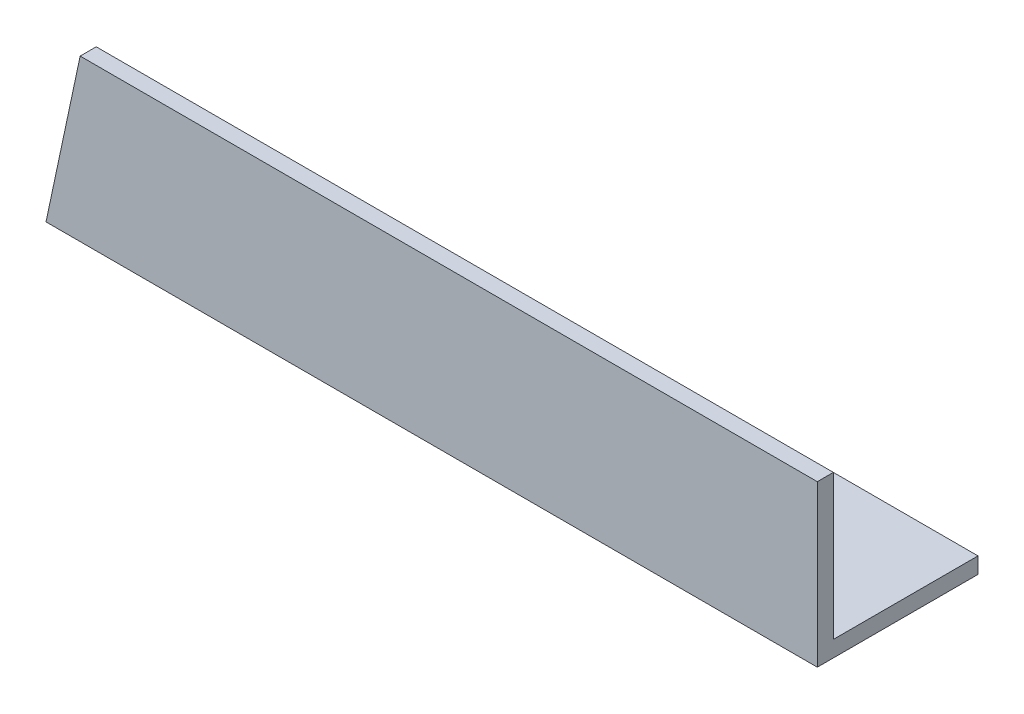
ISO-10303-21;
HEADER;
FILE_DESCRIPTION(('STEP AP214'),'2;1');
FILE_NAME('part.step','',(''),(''),'','','');
FILE_SCHEMA(('AUTOMOTIVE_DESIGN { 1 0 10303 214 1 1 1 1 }'));
ENDSEC;
DATA;
#1=APPLICATION_CONTEXT('core data for automotive mechanical design processes');
#2=APPLICATION_PROTOCOL_DEFINITION('international standard','automotive_design',2000,#1);
#3=PRODUCT_CONTEXT('',#1,'mechanical');
#4=PRODUCT('Part','Part','',(#3));
#5=PRODUCT_RELATED_PRODUCT_CATEGORY('part','',(#4));
#6=PRODUCT_DEFINITION_FORMATION('','',#4);
#7=PRODUCT_DEFINITION_CONTEXT('part definition',#1,'design');
#8=PRODUCT_DEFINITION('design','',#6,#7);
#9=PRODUCT_DEFINITION_SHAPE('','',#8);
#10=(LENGTH_UNIT() NAMED_UNIT(*) SI_UNIT(.MILLI.,.METRE.));
#11=(NAMED_UNIT(*) PLANE_ANGLE_UNIT() SI_UNIT($,.RADIAN.));
#12=(NAMED_UNIT(*) SI_UNIT($,.STERADIAN.) SOLID_ANGLE_UNIT());
#13=UNCERTAINTY_MEASURE_WITH_UNIT(LENGTH_MEASURE(1.E-05),#10,'distance_accuracy_value','');
#14=(GEOMETRIC_REPRESENTATION_CONTEXT(3) GLOBAL_UNCERTAINTY_ASSIGNED_CONTEXT((#13)) GLOBAL_UNIT_ASSIGNED_CONTEXT((#10,
#11,#12)) REPRESENTATION_CONTEXT('',''));
#15=CARTESIAN_POINT('',(0.,0.,0.));
#16=DIRECTION('',(0.,0.,1.));
#17=DIRECTION('',(1.,0.,0.));
#18=AXIS2_PLACEMENT_3D('',#15,#16,#17);
#19=CARTESIAN_POINT('',(96.,20.,0.));
#20=DIRECTION('',(0.,-1.,0.));
#21=DIRECTION('',(0.,0.,-1.));
#22=AXIS2_PLACEMENT_3D('',#19,#20,#21);
#23=PLANE('',#22);
#24=DIRECTION('',(-1.,0.,0.));
#25=VECTOR('',#24,1.);
#26=CARTESIAN_POINT('',(96.,20.,-2.));
#27=LINE('',#26,#25);
#28=CARTESIAN_POINT('',(96.,20.,-2.));
#29=VERTEX_POINT('',#28);
#30=CARTESIAN_POINT('',(4.25113123340029,20.,-2.));
#31=VERTEX_POINT('',#30);
#32=EDGE_CURVE('E118',#29,#31,#27,.T.);
#33=ORIENTED_EDGE('',*,*,#32,.T.);
#34=DIRECTION('',(0.,0.,1.));
#35=VECTOR('',#34,1.);
#36=CARTESIAN_POINT('',(4.25113123340029,20.,-20.));
#37=LINE('',#36,#35);
#38=CARTESIAN_POINT('',(4.25113123340029,20.,0.));
#39=VERTEX_POINT('',#38);
#40=EDGE_CURVE('E135',#31,#39,#37,.T.);
#41=ORIENTED_EDGE('',*,*,#40,.T.);
#42=DIRECTION('',(-1.,0.,0.));
#43=VECTOR('',#42,1.);
#44=CARTESIAN_POINT('',(96.,20.,0.));
#45=LINE('',#44,#43);
#46=CARTESIAN_POINT('',(96.,20.,0.));
#47=VERTEX_POINT('',#46);
#48=EDGE_CURVE('E11',#47,#39,#45,.T.);
#49=ORIENTED_EDGE('',*,*,#48,.F.);
#50=DIRECTION('',(0.,0.,1.));
#51=VECTOR('',#50,1.);
#52=CARTESIAN_POINT('',(96.,20.,0.));
#53=LINE('',#52,#51);
#54=EDGE_CURVE('E98',#29,#47,#53,.T.);
#55=ORIENTED_EDGE('',*,*,#54,.F.);
#56=EDGE_LOOP('',(#33,#41,#49,#55));
#57=FACE_BOUND('',#56,.T.);
#58=ADVANCED_FACE('F39',(#57),#23,.F.);
#59=CARTESIAN_POINT('',(96.,20.,0.));
#60=DIRECTION('',(0.,0.,-1.));
#61=DIRECTION('',(-1.,0.,0.));
#62=AXIS2_PLACEMENT_3D('',#59,#60,#61);
#63=PLANE('',#62);
#64=ORIENTED_EDGE('',*,*,#48,.T.);
#65=DIRECTION('',(0.207911690817752,0.978147600733807,0.));
#66=VECTOR('',#65,1.);
#67=CARTESIAN_POINT('',(0.,0.,0.));
#68=LINE('',#67,#66);
#69=CARTESIAN_POINT('',(0.,0.,0.));
#70=VERTEX_POINT('',#69);
#71=EDGE_CURVE('E90',#70,#39,#68,.T.);
#72=ORIENTED_EDGE('',*,*,#71,.F.);
#73=DIRECTION('',(-1.,0.,0.));
#74=VECTOR('',#73,1.);
#75=CARTESIAN_POINT('',(96.,0.,0.));
#76=LINE('',#75,#74);
#77=CARTESIAN_POINT('',(96.,0.,0.));
#78=VERTEX_POINT('',#77);
#79=EDGE_CURVE('E47',#78,#70,#76,.T.);
#80=ORIENTED_EDGE('',*,*,#79,.F.);
#81=DIRECTION('',(0.,-1.,0.));
#82=VECTOR('',#81,1.);
#83=CARTESIAN_POINT('',(96.,20.,0.));
#84=LINE('',#83,#82);
#85=EDGE_CURVE('E127',#47,#78,#84,.T.);
#86=ORIENTED_EDGE('',*,*,#85,.F.);
#87=EDGE_LOOP('',(#64,#72,#80,#86));
#88=FACE_BOUND('',#87,.T.);
#89=ADVANCED_FACE('F103',(#88),#63,.F.);
#90=CARTESIAN_POINT('',(96.,0.,0.));
#91=DIRECTION('',(0.,1.,0.));
#92=DIRECTION('',(0.,0.,1.));
#93=AXIS2_PLACEMENT_3D('',#90,#91,#92);
#94=PLANE('',#93);
#95=DIRECTION('',(0.,0.,-1.));
#96=VECTOR('',#95,1.);
#97=CARTESIAN_POINT('',(0.,0.,0.));
#98=LINE('',#97,#96);
#99=CARTESIAN_POINT('',(0.,0.,-20.));
#100=VERTEX_POINT('',#99);
#101=EDGE_CURVE('E87',#70,#100,#98,.T.);
#102=ORIENTED_EDGE('',*,*,#101,.T.);
#103=DIRECTION('',(-1.,0.,0.));
#104=VECTOR('',#103,1.);
#105=CARTESIAN_POINT('',(96.,0.,-20.));
#106=LINE('',#105,#104);
#107=CARTESIAN_POINT('',(96.,0.,-20.));
#108=VERTEX_POINT('',#107);
#109=EDGE_CURVE('E109',#108,#100,#106,.T.);
#110=ORIENTED_EDGE('',*,*,#109,.F.);
#111=DIRECTION('',(0.,0.,-1.));
#112=VECTOR('',#111,1.);
#113=CARTESIAN_POINT('',(96.,0.,0.));
#114=LINE('',#113,#112);
#115=EDGE_CURVE('E108',#78,#108,#114,.T.);
#116=ORIENTED_EDGE('',*,*,#115,.F.);
#117=ORIENTED_EDGE('',*,*,#79,.T.);
#118=EDGE_LOOP('',(#102,#110,#116,#117));
#119=FACE_BOUND('',#118,.T.);
#120=ADVANCED_FACE('F107',(#119),#94,.F.);
#121=CARTESIAN_POINT('',(96.,0.,-20.));
#122=DIRECTION('',(0.,0.,1.));
#123=DIRECTION('',(1.,0.,0.));
#124=AXIS2_PLACEMENT_3D('',#121,#122,#123);
#125=PLANE('',#124);
#126=ORIENTED_EDGE('',*,*,#109,.T.);
#127=DIRECTION('',(0.207911690817752,0.978147600733807,0.));
#128=VECTOR('',#127,1.);
#129=CARTESIAN_POINT('',(0.,0.,-20.));
#130=LINE('',#129,#128);
#131=CARTESIAN_POINT('',(0.425113123340026,2.,-20.));
#132=VERTEX_POINT('',#131);
#133=EDGE_CURVE('E93',#100,#132,#130,.T.);
#134=ORIENTED_EDGE('',*,*,#133,.T.);
#135=DIRECTION('',(-1.,0.,0.));
#136=VECTOR('',#135,1.);
#137=CARTESIAN_POINT('',(96.,2.,-20.));
#138=LINE('',#137,#136);
#139=CARTESIAN_POINT('',(96.,2.,-20.));
#140=VERTEX_POINT('',#139);
#141=EDGE_CURVE('E110',#140,#132,#138,.T.);
#142=ORIENTED_EDGE('',*,*,#141,.F.);
#143=DIRECTION('',(0.,1.,0.));
#144=VECTOR('',#143,1.);
#145=CARTESIAN_POINT('',(96.,0.,-20.));
#146=LINE('',#145,#144);
#147=EDGE_CURVE('E124',#108,#140,#146,.T.);
#148=ORIENTED_EDGE('',*,*,#147,.F.);
#149=EDGE_LOOP('',(#126,#134,#142,#148));
#150=FACE_BOUND('',#149,.T.);
#151=ADVANCED_FACE('F139',(#150),#125,.F.);
#152=CARTESIAN_POINT('',(96.,2.,-20.));
#153=DIRECTION('',(0.,-1.,0.));
#154=DIRECTION('',(0.,0.,-1.));
#155=AXIS2_PLACEMENT_3D('',#152,#153,#154);
#156=PLANE('',#155);
#157=ORIENTED_EDGE('',*,*,#141,.T.);
#158=DIRECTION('',(0.,0.,1.));
#159=VECTOR('',#158,1.);
#160=CARTESIAN_POINT('',(0.425113123340037,2.,-20.));
#161=LINE('',#160,#159);
#162=CARTESIAN_POINT('',(0.425113123340027,2.,-2.));
#163=VERTEX_POINT('',#162);
#164=EDGE_CURVE('E99',#132,#163,#161,.T.);
#165=ORIENTED_EDGE('',*,*,#164,.T.);
#166=DIRECTION('',(-1.,0.,0.));
#167=VECTOR('',#166,1.);
#168=CARTESIAN_POINT('',(96.,2.,-2.));
#169=LINE('',#168,#167);
#170=CARTESIAN_POINT('',(96.,2.,-2.));
#171=VERTEX_POINT('',#170);
#172=EDGE_CURVE('E115',#171,#163,#169,.T.);
#173=ORIENTED_EDGE('',*,*,#172,.F.);
#174=DIRECTION('',(0.,0.,1.));
#175=VECTOR('',#174,1.);
#176=CARTESIAN_POINT('',(96.,2.,-20.));
#177=LINE('',#176,#175);
#178=EDGE_CURVE('E122',#140,#171,#177,.T.);
#179=ORIENTED_EDGE('',*,*,#178,.F.);
#180=EDGE_LOOP('',(#157,#165,#173,#179));
#181=FACE_BOUND('',#180,.T.);
#182=ADVANCED_FACE('F143',(#181),#156,.F.);
#183=CARTESIAN_POINT('',(96.,2.,-2.));
#184=DIRECTION('',(0.,0.,1.));
#185=DIRECTION('',(0.,-1.,0.));
#186=AXIS2_PLACEMENT_3D('',#183,#184,#185);
#187=PLANE('',#186);
#188=ORIENTED_EDGE('',*,*,#172,.T.);
#189=DIRECTION('',(0.207911690817752,0.978147600733807,0.));
#190=VECTOR('',#189,1.);
#191=CARTESIAN_POINT('',(4.55655467623066,21.4369043252804,-2.));
#192=LINE('',#191,#190);
#193=EDGE_CURVE('E132',#163,#31,#192,.T.);
#194=ORIENTED_EDGE('',*,*,#193,.T.);
#195=ORIENTED_EDGE('',*,*,#32,.F.);
#196=DIRECTION('',(0.,1.,0.));
#197=VECTOR('',#196,1.);
#198=CARTESIAN_POINT('',(96.,2.,-2.));
#199=LINE('',#198,#197);
#200=EDGE_CURVE('E54',#171,#29,#199,.T.);
#201=ORIENTED_EDGE('',*,*,#200,.F.);
#202=EDGE_LOOP('',(#188,#194,#195,#201));
#203=FACE_BOUND('',#202,.T.);
#204=ADVANCED_FACE('F149',(#203),#187,.F.);
#205=CARTESIAN_POINT('',(96.,0.,0.));
#206=DIRECTION('',(1.,0.,0.));
#207=DIRECTION('',(0.,0.,-1.));
#208=AXIS2_PLACEMENT_3D('',#205,#206,#207);
#209=PLANE('',#208);
#210=ORIENTED_EDGE('',*,*,#54,.T.);
#211=ORIENTED_EDGE('',*,*,#85,.T.);
#212=ORIENTED_EDGE('',*,*,#115,.T.);
#213=ORIENTED_EDGE('',*,*,#147,.T.);
#214=ORIENTED_EDGE('',*,*,#178,.T.);
#215=ORIENTED_EDGE('',*,*,#200,.T.);
#216=EDGE_LOOP('',(#210,#211,#212,#213,#214,#215));
#217=FACE_BOUND('',#216,.T.);
#218=ADVANCED_FACE('F145',(#217),#209,.T.);
#219=CARTESIAN_POINT('',(0.,0.,-20.));
#220=DIRECTION('',(0.978147600733807,-0.207911690817752,0.));
#221=DIRECTION('',(0.207911690817752,0.978147600733807,0.));
#222=AXIS2_PLACEMENT_3D('',#219,#220,#221);
#223=PLANE('',#222);
#224=ORIENTED_EDGE('',*,*,#133,.F.);
#225=ORIENTED_EDGE('',*,*,#101,.F.);
#226=ORIENTED_EDGE('',*,*,#71,.T.);
#227=ORIENTED_EDGE('',*,*,#40,.F.);
#228=ORIENTED_EDGE('',*,*,#193,.F.);
#229=ORIENTED_EDGE('',*,*,#164,.F.);
#230=EDGE_LOOP('',(#224,#225,#226,#227,#228,#229));
#231=FACE_BOUND('',#230,.T.);
#232=ADVANCED_FACE('F89',(#231),#223,.F.);
#233=CLOSED_SHELL('',(#58,#89,#120,#151,#182,#204,#218,#232));
#234=MANIFOLD_SOLID_BREP('B2',#233);
#235=ADVANCED_BREP_SHAPE_REPRESENTATION('',(#18,#234),#14);
#236=SHAPE_DEFINITION_REPRESENTATION(#9,#235);
ENDSEC;
END-ISO-10303-21;
